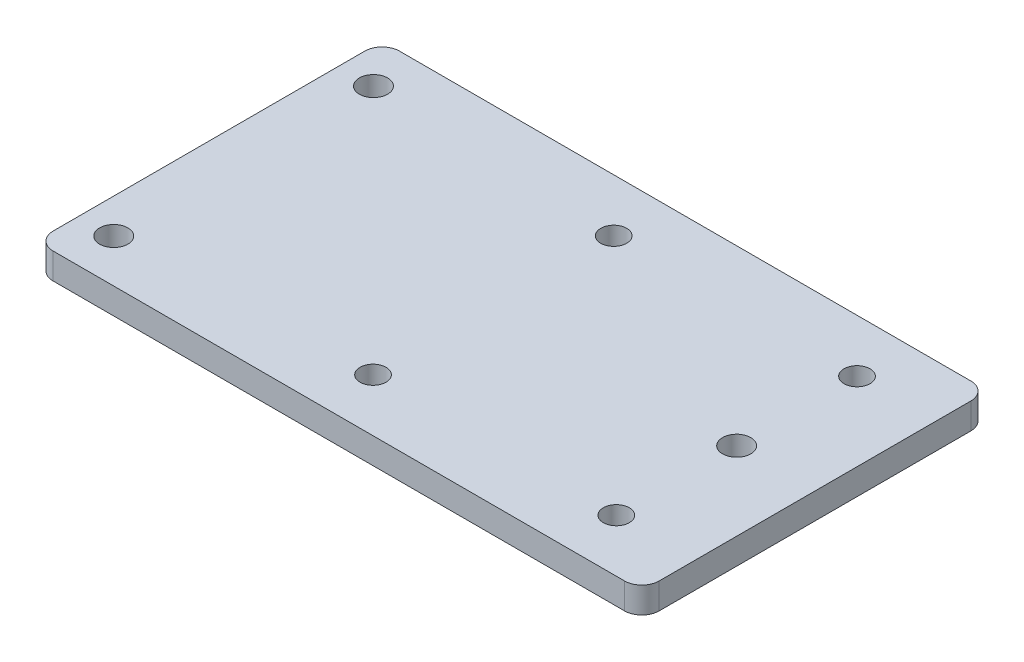
ISO-10303-21;
HEADER;
FILE_DESCRIPTION(('STEP AP214'),'2;1');
FILE_NAME('part.step','',(''),(''),'','','');
FILE_SCHEMA(('AUTOMOTIVE_DESIGN { 1 0 10303 214 1 1 1 1 }'));
ENDSEC;
DATA;
#1=APPLICATION_CONTEXT('core data for automotive mechanical design processes');
#2=APPLICATION_PROTOCOL_DEFINITION('international standard','automotive_design',2000,#1);
#3=PRODUCT_CONTEXT('',#1,'mechanical');
#4=PRODUCT('Part','Part','',(#3));
#5=PRODUCT_RELATED_PRODUCT_CATEGORY('part','',(#4));
#6=PRODUCT_DEFINITION_FORMATION('','',#4);
#7=PRODUCT_DEFINITION_CONTEXT('part definition',#1,'design');
#8=PRODUCT_DEFINITION('design','',#6,#7);
#9=PRODUCT_DEFINITION_SHAPE('','',#8);
#10=(LENGTH_UNIT() NAMED_UNIT(*) SI_UNIT(.MILLI.,.METRE.));
#11=(NAMED_UNIT(*) PLANE_ANGLE_UNIT() SI_UNIT($,.RADIAN.));
#12=(NAMED_UNIT(*) SI_UNIT($,.STERADIAN.) SOLID_ANGLE_UNIT());
#13=UNCERTAINTY_MEASURE_WITH_UNIT(LENGTH_MEASURE(1.E-05),#10,'distance_accuracy_value','');
#14=(GEOMETRIC_REPRESENTATION_CONTEXT(3) GLOBAL_UNCERTAINTY_ASSIGNED_CONTEXT((#13)) GLOBAL_UNIT_ASSIGNED_CONTEXT((#10,
#11,#12)) REPRESENTATION_CONTEXT('',''));
#15=CARTESIAN_POINT('',(0.,0.,0.));
#16=DIRECTION('',(0.,0.,1.));
#17=DIRECTION('',(1.,0.,0.));
#18=AXIS2_PLACEMENT_3D('',#15,#16,#17);
#19=CARTESIAN_POINT('',(35.,3.,-20.));
#20=DIRECTION('',(-1.,0.,0.));
#21=DIRECTION('',(0.,0.,1.));
#22=AXIS2_PLACEMENT_3D('',#19,#20,#21);
#23=PLANE('',#22);
#24=DIRECTION('',(0.,0.,-1.));
#25=VECTOR('',#24,1.);
#26=CARTESIAN_POINT('',(35.,0.,-20.));
#27=LINE('',#26,#25);
#28=CARTESIAN_POINT('',(35.,0.,18.));
#29=VERTEX_POINT('',#28);
#30=CARTESIAN_POINT('',(35.,0.,-18.));
#31=VERTEX_POINT('',#30);
#32=EDGE_CURVE('E128',#29,#31,#27,.T.);
#33=ORIENTED_EDGE('',*,*,#32,.T.);
#34=DIRECTION('',(0.,-1.,0.));
#35=VECTOR('',#34,1.);
#36=CARTESIAN_POINT('',(35.,3.,-18.));
#37=LINE('',#36,#35);
#38=CARTESIAN_POINT('',(35.,3.,-18.));
#39=VERTEX_POINT('',#38);
#40=EDGE_CURVE('E105',#31,#39,#37,.F.);
#41=ORIENTED_EDGE('',*,*,#40,.T.);
#42=DIRECTION('',(0.,0.,-1.));
#43=VECTOR('',#42,1.);
#44=CARTESIAN_POINT('',(35.,3.,-20.));
#45=LINE('',#44,#43);
#46=CARTESIAN_POINT('',(35.,3.,18.));
#47=VERTEX_POINT('',#46);
#48=EDGE_CURVE('E138',#47,#39,#45,.T.);
#49=ORIENTED_EDGE('',*,*,#48,.F.);
#50=DIRECTION('',(0.,-1.,0.));
#51=VECTOR('',#50,1.);
#52=CARTESIAN_POINT('',(35.,3.,18.));
#53=LINE('',#52,#51);
#54=EDGE_CURVE('E110',#47,#29,#53,.T.);
#55=ORIENTED_EDGE('',*,*,#54,.T.);
#56=EDGE_LOOP('',(#33,#41,#49,#55));
#57=FACE_BOUND('',#56,.T.);
#58=ADVANCED_FACE('F33',(#57),#23,.F.);
#59=CARTESIAN_POINT('',(-35.,3.,-20.));
#60=DIRECTION('',(0.,0.,1.));
#61=DIRECTION('',(1.,0.,0.));
#62=AXIS2_PLACEMENT_3D('',#59,#60,#61);
#63=PLANE('',#62);
#64=DIRECTION('',(-1.,0.,0.));
#65=VECTOR('',#64,1.);
#66=CARTESIAN_POINT('',(-35.,3.,-20.));
#67=LINE('',#66,#65);
#68=CARTESIAN_POINT('',(33.,3.,-20.));
#69=VERTEX_POINT('',#68);
#70=CARTESIAN_POINT('',(-33.,3.,-20.));
#71=VERTEX_POINT('',#70);
#72=EDGE_CURVE('E120',#69,#71,#67,.T.);
#73=ORIENTED_EDGE('',*,*,#72,.F.);
#74=DIRECTION('',(0.,-1.,0.));
#75=VECTOR('',#74,1.);
#76=CARTESIAN_POINT('',(33.,3.,-20.));
#77=LINE('',#76,#75);
#78=CARTESIAN_POINT('',(33.,0.,-20.));
#79=VERTEX_POINT('',#78);
#80=EDGE_CURVE('E104',#69,#79,#77,.T.);
#81=ORIENTED_EDGE('',*,*,#80,.T.);
#82=DIRECTION('',(-1.,0.,0.));
#83=VECTOR('',#82,1.);
#84=CARTESIAN_POINT('',(-35.,0.,-20.));
#85=LINE('',#84,#83);
#86=CARTESIAN_POINT('',(-33.,0.,-20.));
#87=VERTEX_POINT('',#86);
#88=EDGE_CURVE('E117',#79,#87,#85,.T.);
#89=ORIENTED_EDGE('',*,*,#88,.T.);
#90=DIRECTION('',(0.,-1.,0.));
#91=VECTOR('',#90,1.);
#92=CARTESIAN_POINT('',(-33.,3.,-20.));
#93=LINE('',#92,#91);
#94=EDGE_CURVE('E122',#87,#71,#93,.F.);
#95=ORIENTED_EDGE('',*,*,#94,.T.);
#96=EDGE_LOOP('',(#73,#81,#89,#95));
#97=FACE_BOUND('',#96,.T.);
#98=ADVANCED_FACE('F116',(#97),#63,.F.);
#99=CARTESIAN_POINT('',(-35.,3.,-20.));
#100=DIRECTION('',(1.,0.,0.));
#101=DIRECTION('',(0.,0.,-1.));
#102=AXIS2_PLACEMENT_3D('',#99,#100,#101);
#103=PLANE('',#102);
#104=DIRECTION('',(0.,0.,1.));
#105=VECTOR('',#104,1.);
#106=CARTESIAN_POINT('',(-35.,3.,-20.));
#107=LINE('',#106,#105);
#108=CARTESIAN_POINT('',(-35.,3.,-18.));
#109=VERTEX_POINT('',#108);
#110=CARTESIAN_POINT('',(-35.,3.,18.));
#111=VERTEX_POINT('',#110);
#112=EDGE_CURVE('E161',#109,#111,#107,.T.);
#113=ORIENTED_EDGE('',*,*,#112,.F.);
#114=DIRECTION('',(0.,-1.,0.));
#115=VECTOR('',#114,1.);
#116=CARTESIAN_POINT('',(-35.,3.,-18.));
#117=LINE('',#116,#115);
#118=CARTESIAN_POINT('',(-35.,0.,-18.));
#119=VERTEX_POINT('',#118);
#120=EDGE_CURVE('E11',#109,#119,#117,.T.);
#121=ORIENTED_EDGE('',*,*,#120,.T.);
#122=DIRECTION('',(0.,0.,1.));
#123=VECTOR('',#122,1.);
#124=CARTESIAN_POINT('',(-35.,0.,-20.));
#125=LINE('',#124,#123);
#126=CARTESIAN_POINT('',(-35.,0.,18.));
#127=VERTEX_POINT('',#126);
#128=EDGE_CURVE('E127',#119,#127,#125,.T.);
#129=ORIENTED_EDGE('',*,*,#128,.T.);
#130=DIRECTION('',(0.,-1.,0.));
#131=VECTOR('',#130,1.);
#132=CARTESIAN_POINT('',(-35.,3.,18.));
#133=LINE('',#132,#131);
#134=EDGE_CURVE('E41',#127,#111,#133,.F.);
#135=ORIENTED_EDGE('',*,*,#134,.T.);
#136=EDGE_LOOP('',(#113,#121,#129,#135));
#137=FACE_BOUND('',#136,.T.);
#138=ADVANCED_FACE('F160',(#137),#103,.F.);
#139=CARTESIAN_POINT('',(-35.,3.,20.));
#140=DIRECTION('',(0.,0.,-1.));
#141=DIRECTION('',(-1.,0.,0.));
#142=AXIS2_PLACEMENT_3D('',#139,#140,#141);
#143=PLANE('',#142);
#144=DIRECTION('',(1.,0.,0.));
#145=VECTOR('',#144,1.);
#146=CARTESIAN_POINT('',(-35.,0.,20.));
#147=LINE('',#146,#145);
#148=CARTESIAN_POINT('',(-33.,0.,20.));
#149=VERTEX_POINT('',#148);
#150=CARTESIAN_POINT('',(33.,0.,20.));
#151=VERTEX_POINT('',#150);
#152=EDGE_CURVE('E131',#149,#151,#147,.T.);
#153=ORIENTED_EDGE('',*,*,#152,.T.);
#154=DIRECTION('',(0.,-1.,0.));
#155=VECTOR('',#154,1.);
#156=CARTESIAN_POINT('',(33.,3.,20.));
#157=LINE('',#156,#155);
#158=CARTESIAN_POINT('',(33.,3.,20.));
#159=VERTEX_POINT('',#158);
#160=EDGE_CURVE('E48',#151,#159,#157,.F.);
#161=ORIENTED_EDGE('',*,*,#160,.T.);
#162=DIRECTION('',(1.,0.,0.));
#163=VECTOR('',#162,1.);
#164=CARTESIAN_POINT('',(-35.,3.,20.));
#165=LINE('',#164,#163);
#166=CARTESIAN_POINT('',(-33.,3.,20.));
#167=VERTEX_POINT('',#166);
#168=EDGE_CURVE('E139',#167,#159,#165,.T.);
#169=ORIENTED_EDGE('',*,*,#168,.F.);
#170=DIRECTION('',(0.,-1.,0.));
#171=VECTOR('',#170,1.);
#172=CARTESIAN_POINT('',(-33.,3.,20.));
#173=LINE('',#172,#171);
#174=EDGE_CURVE('E154',#167,#149,#173,.T.);
#175=ORIENTED_EDGE('',*,*,#174,.T.);
#176=EDGE_LOOP('',(#153,#161,#169,#175));
#177=FACE_BOUND('',#176,.T.);
#178=ADVANCED_FACE('F170',(#177),#143,.F.);
#179=CARTESIAN_POINT('',(0.,3.,0.));
#180=DIRECTION('',(0.,1.,0.));
#181=DIRECTION('',(0.,0.,1.));
#182=AXIS2_PLACEMENT_3D('',#179,#180,#181);
#183=PLANE('',#182);
#184=CARTESIAN_POINT('',(-31.,3.,-15.));
#185=DIRECTION('',(0.,1.,0.));
#186=DIRECTION('',(0.,0.,1.));
#187=AXIS2_PLACEMENT_3D('',#184,#185,#186);
#188=CIRCLE('',#187,1.63195);
#189=CARTESIAN_POINT('',(-31.,3.,-13.36805));
#190=VERTEX_POINT('',#189);
#191=EDGE_CURVE('E218',#190,#190,#188,.T.);
#192=ORIENTED_EDGE('',*,*,#191,.F.);
#193=EDGE_LOOP('',(#192));
#194=FACE_BOUND('',#193,.T.);
#195=CARTESIAN_POINT('',(-31.,3.,15.));
#196=DIRECTION('',(0.,1.,0.));
#197=DIRECTION('',(0.,0.,1.));
#198=AXIS2_PLACEMENT_3D('',#195,#196,#197);
#199=CIRCLE('',#198,1.63195);
#200=CARTESIAN_POINT('',(-31.,3.,16.63195));
#201=VERTEX_POINT('',#200);
#202=EDGE_CURVE('E212',#201,#201,#199,.T.);
#203=ORIENTED_EDGE('',*,*,#202,.F.);
#204=EDGE_LOOP('',(#203));
#205=FACE_BOUND('',#204,.T.);
#206=CARTESIAN_POINT('',(25.95,3.,0.));
#207=DIRECTION('',(0.,1.,0.));
#208=DIRECTION('',(0.,0.,1.));
#209=AXIS2_PLACEMENT_3D('',#206,#207,#208);
#210=CIRCLE('',#209,1.63195);
#211=CARTESIAN_POINT('',(25.95,3.,1.63195));
#212=VERTEX_POINT('',#211);
#213=EDGE_CURVE('E206',#212,#212,#210,.T.);
#214=ORIENTED_EDGE('',*,*,#213,.F.);
#215=EDGE_LOOP('',(#214));
#216=FACE_BOUND('',#215,.T.);
#217=CARTESIAN_POINT('',(-2.14999999999999,3.,-13.9));
#218=DIRECTION('',(0.,1.,0.));
#219=DIRECTION('',(0.,0.,1.));
#220=AXIS2_PLACEMENT_3D('',#217,#218,#219);
#221=CIRCLE('',#220,1.49999999999999);
#222=CARTESIAN_POINT('',(-2.14999999999999,3.,-12.4));
#223=VERTEX_POINT('',#222);
#224=EDGE_CURVE('E200',#223,#223,#221,.T.);
#225=ORIENTED_EDGE('',*,*,#224,.F.);
#226=EDGE_LOOP('',(#225));
#227=FACE_BOUND('',#226,.T.);
#228=CARTESIAN_POINT('',(25.95,3.,-13.9));
#229=DIRECTION('',(0.,1.,0.));
#230=DIRECTION('',(0.,0.,1.));
#231=AXIS2_PLACEMENT_3D('',#228,#229,#230);
#232=CIRCLE('',#231,1.49999999999999);
#233=CARTESIAN_POINT('',(25.95,3.,-12.4));
#234=VERTEX_POINT('',#233);
#235=EDGE_CURVE('E194',#234,#234,#232,.T.);
#236=ORIENTED_EDGE('',*,*,#235,.F.);
#237=EDGE_LOOP('',(#236));
#238=FACE_BOUND('',#237,.T.);
#239=CARTESIAN_POINT('',(-2.14999999999999,3.,13.9));
#240=DIRECTION('',(0.,1.,0.));
#241=DIRECTION('',(0.,0.,1.));
#242=AXIS2_PLACEMENT_3D('',#239,#240,#241);
#243=CIRCLE('',#242,1.49999999999999);
#244=CARTESIAN_POINT('',(-2.14999999999999,3.,15.4));
#245=VERTEX_POINT('',#244);
#246=EDGE_CURVE('E188',#245,#245,#243,.T.);
#247=ORIENTED_EDGE('',*,*,#246,.F.);
#248=EDGE_LOOP('',(#247));
#249=FACE_BOUND('',#248,.T.);
#250=CARTESIAN_POINT('',(25.95,3.,13.9));
#251=DIRECTION('',(0.,1.,0.));
#252=DIRECTION('',(0.,0.,1.));
#253=AXIS2_PLACEMENT_3D('',#250,#251,#252);
#254=CIRCLE('',#253,1.49999999999999);
#255=CARTESIAN_POINT('',(25.95,3.,15.4));
#256=VERTEX_POINT('',#255);
#257=EDGE_CURVE('E182',#256,#256,#254,.T.);
#258=ORIENTED_EDGE('',*,*,#257,.F.);
#259=EDGE_LOOP('',(#258));
#260=FACE_BOUND('',#259,.T.);
#261=ORIENTED_EDGE('',*,*,#48,.T.);
#262=CARTESIAN_POINT('',(33.,3.,-18.));
#263=DIRECTION('',(0.,1.,0.));
#264=DIRECTION('',(0.,0.,1.));
#265=AXIS2_PLACEMENT_3D('',#262,#263,#264);
#266=CIRCLE('',#265,2.);
#267=EDGE_CURVE('E152',#39,#69,#266,.T.);
#268=ORIENTED_EDGE('',*,*,#267,.T.);
#269=ORIENTED_EDGE('',*,*,#72,.T.);
#270=CARTESIAN_POINT('',(-33.,3.,-18.));
#271=DIRECTION('',(0.,1.,0.));
#272=DIRECTION('',(0.,0.,1.));
#273=AXIS2_PLACEMENT_3D('',#270,#271,#272);
#274=CIRCLE('',#273,2.);
#275=EDGE_CURVE('E148',#71,#109,#274,.T.);
#276=ORIENTED_EDGE('',*,*,#275,.T.);
#277=ORIENTED_EDGE('',*,*,#112,.T.);
#278=CARTESIAN_POINT('',(-33.,3.,18.));
#279=DIRECTION('',(0.,1.,0.));
#280=DIRECTION('',(0.,0.,1.));
#281=AXIS2_PLACEMENT_3D('',#278,#279,#280);
#282=CIRCLE('',#281,2.);
#283=EDGE_CURVE('E55',#111,#167,#282,.T.);
#284=ORIENTED_EDGE('',*,*,#283,.T.);
#285=ORIENTED_EDGE('',*,*,#168,.T.);
#286=CARTESIAN_POINT('',(33.,3.,18.));
#287=DIRECTION('',(0.,1.,0.));
#288=DIRECTION('',(0.,0.,1.));
#289=AXIS2_PLACEMENT_3D('',#286,#287,#288);
#290=CIRCLE('',#289,2.);
#291=EDGE_CURVE('E150',#159,#47,#290,.T.);
#292=ORIENTED_EDGE('',*,*,#291,.T.);
#293=EDGE_LOOP('',(#261,#268,#269,#276,#277,#284,#285,#292));
#294=FACE_BOUND('',#293,.T.);
#295=ADVANCED_FACE('F165',(#194,#205,#216,#227,#238,#249,#260,#294),#183,.T.);
#296=CARTESIAN_POINT('',(0.,0.,0.));
#297=DIRECTION('',(0.,1.,0.));
#298=DIRECTION('',(0.,0.,1.));
#299=AXIS2_PLACEMENT_3D('',#296,#297,#298);
#300=PLANE('',#299);
#301=CARTESIAN_POINT('',(-31.,0.,-15.));
#302=DIRECTION('',(0.,1.,0.));
#303=DIRECTION('',(0.,0.,1.));
#304=AXIS2_PLACEMENT_3D('',#301,#302,#303);
#305=CIRCLE('',#304,1.63195);
#306=CARTESIAN_POINT('',(-31.,0.,-13.36805));
#307=VERTEX_POINT('',#306);
#308=EDGE_CURVE('E215',#307,#307,#305,.T.);
#309=ORIENTED_EDGE('',*,*,#308,.T.);
#310=EDGE_LOOP('',(#309));
#311=FACE_BOUND('',#310,.T.);
#312=CARTESIAN_POINT('',(-31.,0.,15.));
#313=DIRECTION('',(0.,1.,0.));
#314=DIRECTION('',(0.,0.,1.));
#315=AXIS2_PLACEMENT_3D('',#312,#313,#314);
#316=CIRCLE('',#315,1.63195);
#317=CARTESIAN_POINT('',(-31.,0.,16.63195));
#318=VERTEX_POINT('',#317);
#319=EDGE_CURVE('E209',#318,#318,#316,.T.);
#320=ORIENTED_EDGE('',*,*,#319,.T.);
#321=EDGE_LOOP('',(#320));
#322=FACE_BOUND('',#321,.T.);
#323=CARTESIAN_POINT('',(25.95,0.,0.));
#324=DIRECTION('',(0.,1.,0.));
#325=DIRECTION('',(0.,0.,1.));
#326=AXIS2_PLACEMENT_3D('',#323,#324,#325);
#327=CIRCLE('',#326,1.63195);
#328=CARTESIAN_POINT('',(25.95,0.,1.63195));
#329=VERTEX_POINT('',#328);
#330=EDGE_CURVE('E203',#329,#329,#327,.T.);
#331=ORIENTED_EDGE('',*,*,#330,.T.);
#332=EDGE_LOOP('',(#331));
#333=FACE_BOUND('',#332,.T.);
#334=CARTESIAN_POINT('',(-2.14999999999999,0.,-13.9));
#335=DIRECTION('',(0.,1.,0.));
#336=DIRECTION('',(0.,0.,1.));
#337=AXIS2_PLACEMENT_3D('',#334,#335,#336);
#338=CIRCLE('',#337,1.5);
#339=CARTESIAN_POINT('',(-2.14999999999999,0.,-12.4));
#340=VERTEX_POINT('',#339);
#341=EDGE_CURVE('E197',#340,#340,#338,.T.);
#342=ORIENTED_EDGE('',*,*,#341,.T.);
#343=EDGE_LOOP('',(#342));
#344=FACE_BOUND('',#343,.T.);
#345=CARTESIAN_POINT('',(25.95,0.,-13.9));
#346=DIRECTION('',(0.,1.,0.));
#347=DIRECTION('',(0.,0.,1.));
#348=AXIS2_PLACEMENT_3D('',#345,#346,#347);
#349=CIRCLE('',#348,1.5);
#350=CARTESIAN_POINT('',(25.95,0.,-12.4));
#351=VERTEX_POINT('',#350);
#352=EDGE_CURVE('E191',#351,#351,#349,.T.);
#353=ORIENTED_EDGE('',*,*,#352,.T.);
#354=EDGE_LOOP('',(#353));
#355=FACE_BOUND('',#354,.T.);
#356=CARTESIAN_POINT('',(-2.14999999999999,0.,13.9));
#357=DIRECTION('',(0.,1.,0.));
#358=DIRECTION('',(0.,0.,1.));
#359=AXIS2_PLACEMENT_3D('',#356,#357,#358);
#360=CIRCLE('',#359,1.5);
#361=CARTESIAN_POINT('',(-2.14999999999999,0.,15.4));
#362=VERTEX_POINT('',#361);
#363=EDGE_CURVE('E185',#362,#362,#360,.T.);
#364=ORIENTED_EDGE('',*,*,#363,.T.);
#365=EDGE_LOOP('',(#364));
#366=FACE_BOUND('',#365,.T.);
#367=CARTESIAN_POINT('',(25.95,0.,13.9));
#368=DIRECTION('',(0.,1.,0.));
#369=DIRECTION('',(0.,0.,1.));
#370=AXIS2_PLACEMENT_3D('',#367,#368,#369);
#371=CIRCLE('',#370,1.5);
#372=CARTESIAN_POINT('',(25.95,0.,15.4));
#373=VERTEX_POINT('',#372);
#374=EDGE_CURVE('E133',#373,#373,#371,.T.);
#375=ORIENTED_EDGE('',*,*,#374,.T.);
#376=EDGE_LOOP('',(#375));
#377=FACE_BOUND('',#376,.T.);
#378=ORIENTED_EDGE('',*,*,#88,.F.);
#379=CARTESIAN_POINT('',(33.,0.,-18.));
#380=DIRECTION('',(0.,1.,0.));
#381=DIRECTION('',(0.,0.,1.));
#382=AXIS2_PLACEMENT_3D('',#379,#380,#381);
#383=CIRCLE('',#382,2.);
#384=EDGE_CURVE('E100',#79,#31,#383,.F.);
#385=ORIENTED_EDGE('',*,*,#384,.T.);
#386=ORIENTED_EDGE('',*,*,#32,.F.);
#387=CARTESIAN_POINT('',(33.,0.,18.));
#388=DIRECTION('',(0.,1.,0.));
#389=DIRECTION('',(0.,0.,1.));
#390=AXIS2_PLACEMENT_3D('',#387,#388,#389);
#391=CIRCLE('',#390,2.);
#392=EDGE_CURVE('E111',#29,#151,#391,.F.);
#393=ORIENTED_EDGE('',*,*,#392,.T.);
#394=ORIENTED_EDGE('',*,*,#152,.F.);
#395=CARTESIAN_POINT('',(-33.,0.,18.));
#396=DIRECTION('',(0.,1.,0.));
#397=DIRECTION('',(0.,0.,1.));
#398=AXIS2_PLACEMENT_3D('',#395,#396,#397);
#399=CIRCLE('',#398,2.);
#400=EDGE_CURVE('E121',#149,#127,#399,.F.);
#401=ORIENTED_EDGE('',*,*,#400,.T.);
#402=ORIENTED_EDGE('',*,*,#128,.F.);
#403=CARTESIAN_POINT('',(-33.,0.,-18.));
#404=DIRECTION('',(0.,1.,0.));
#405=DIRECTION('',(0.,0.,1.));
#406=AXIS2_PLACEMENT_3D('',#403,#404,#405);
#407=CIRCLE('',#406,2.);
#408=EDGE_CURVE('E126',#119,#87,#407,.F.);
#409=ORIENTED_EDGE('',*,*,#408,.T.);
#410=EDGE_LOOP('',(#378,#385,#386,#393,#394,#401,#402,#409));
#411=FACE_BOUND('',#410,.T.);
#412=ADVANCED_FACE('F124',(#311,#322,#333,#344,#355,#366,#377,#411),#300,.F.);
#413=CARTESIAN_POINT('',(25.95,3.,13.9));
#414=DIRECTION('',(0.,1.,0.));
#415=DIRECTION('',(0.,0.,1.));
#416=AXIS2_PLACEMENT_3D('',#413,#414,#415);
#417=CYLINDRICAL_SURFACE('',#416,1.49999999999999);
#418=ORIENTED_EDGE('',*,*,#374,.F.);
#419=EDGE_LOOP('',(#418));
#420=FACE_BOUND('',#419,.T.);
#421=ORIENTED_EDGE('',*,*,#257,.T.);
#422=EDGE_LOOP('',(#421));
#423=FACE_BOUND('',#422,.T.);
#424=ADVANCED_FACE('F239',(#420,#423),#417,.F.);
#425=CARTESIAN_POINT('',(-2.14999999999999,3.,13.9));
#426=DIRECTION('',(0.,1.,0.));
#427=DIRECTION('',(0.,0.,1.));
#428=AXIS2_PLACEMENT_3D('',#425,#426,#427);
#429=CYLINDRICAL_SURFACE('',#428,1.49999999999999);
#430=ORIENTED_EDGE('',*,*,#363,.F.);
#431=EDGE_LOOP('',(#430));
#432=FACE_BOUND('',#431,.T.);
#433=ORIENTED_EDGE('',*,*,#246,.T.);
#434=EDGE_LOOP('',(#433));
#435=FACE_BOUND('',#434,.T.);
#436=ADVANCED_FACE('F241',(#432,#435),#429,.F.);
#437=CARTESIAN_POINT('',(25.95,3.,-13.9));
#438=DIRECTION('',(0.,1.,0.));
#439=DIRECTION('',(0.,0.,1.));
#440=AXIS2_PLACEMENT_3D('',#437,#438,#439);
#441=CYLINDRICAL_SURFACE('',#440,1.49999999999999);
#442=ORIENTED_EDGE('',*,*,#352,.F.);
#443=EDGE_LOOP('',(#442));
#444=FACE_BOUND('',#443,.T.);
#445=ORIENTED_EDGE('',*,*,#235,.T.);
#446=EDGE_LOOP('',(#445));
#447=FACE_BOUND('',#446,.T.);
#448=ADVANCED_FACE('F248',(#444,#447),#441,.F.);
#449=CARTESIAN_POINT('',(-2.14999999999999,3.,-13.9));
#450=DIRECTION('',(0.,1.,0.));
#451=DIRECTION('',(0.,0.,1.));
#452=AXIS2_PLACEMENT_3D('',#449,#450,#451);
#453=CYLINDRICAL_SURFACE('',#452,1.49999999999999);
#454=ORIENTED_EDGE('',*,*,#341,.F.);
#455=EDGE_LOOP('',(#454));
#456=FACE_BOUND('',#455,.T.);
#457=ORIENTED_EDGE('',*,*,#224,.T.);
#458=EDGE_LOOP('',(#457));
#459=FACE_BOUND('',#458,.T.);
#460=ADVANCED_FACE('F356',(#456,#459),#453,.F.);
#461=CARTESIAN_POINT('',(25.95,3.,0.));
#462=DIRECTION('',(0.,1.,0.));
#463=DIRECTION('',(0.,0.,1.));
#464=AXIS2_PLACEMENT_3D('',#461,#462,#463);
#465=CYLINDRICAL_SURFACE('',#464,1.63195);
#466=ORIENTED_EDGE('',*,*,#330,.F.);
#467=EDGE_LOOP('',(#466));
#468=FACE_BOUND('',#467,.T.);
#469=ORIENTED_EDGE('',*,*,#213,.T.);
#470=EDGE_LOOP('',(#469));
#471=FACE_BOUND('',#470,.T.);
#472=ADVANCED_FACE('F346',(#468,#471),#465,.F.);
#473=CARTESIAN_POINT('',(-31.,3.,15.));
#474=DIRECTION('',(0.,1.,0.));
#475=DIRECTION('',(0.,0.,1.));
#476=AXIS2_PLACEMENT_3D('',#473,#474,#475);
#477=CYLINDRICAL_SURFACE('',#476,1.63195);
#478=ORIENTED_EDGE('',*,*,#319,.F.);
#479=EDGE_LOOP('',(#478));
#480=FACE_BOUND('',#479,.T.);
#481=ORIENTED_EDGE('',*,*,#202,.T.);
#482=EDGE_LOOP('',(#481));
#483=FACE_BOUND('',#482,.T.);
#484=ADVANCED_FACE('F336',(#480,#483),#477,.F.);
#485=CARTESIAN_POINT('',(-31.,3.,-15.));
#486=DIRECTION('',(0.,1.,0.));
#487=DIRECTION('',(0.,0.,1.));
#488=AXIS2_PLACEMENT_3D('',#485,#486,#487);
#489=CYLINDRICAL_SURFACE('',#488,1.63195);
#490=ORIENTED_EDGE('',*,*,#308,.F.);
#491=EDGE_LOOP('',(#490));
#492=FACE_BOUND('',#491,.T.);
#493=ORIENTED_EDGE('',*,*,#191,.T.);
#494=EDGE_LOOP('',(#493));
#495=FACE_BOUND('',#494,.T.);
#496=ADVANCED_FACE('F222',(#492,#495),#489,.F.);
#497=CARTESIAN_POINT('',(33.,3.,-18.));
#498=DIRECTION('',(0.,-1.,0.));
#499=DIRECTION('',(0.,0.,-1.));
#500=AXIS2_PLACEMENT_3D('',#497,#498,#499);
#501=CYLINDRICAL_SURFACE('',#500,2.);
#502=ORIENTED_EDGE('',*,*,#267,.F.);
#503=ORIENTED_EDGE('',*,*,#40,.F.);
#504=ORIENTED_EDGE('',*,*,#384,.F.);
#505=ORIENTED_EDGE('',*,*,#80,.F.);
#506=EDGE_LOOP('',(#502,#503,#504,#505));
#507=FACE_BOUND('',#506,.T.);
#508=ADVANCED_FACE('F103',(#507),#501,.T.);
#509=CARTESIAN_POINT('',(33.,3.,18.));
#510=DIRECTION('',(0.,-1.,0.));
#511=DIRECTION('',(0.,0.,-1.));
#512=AXIS2_PLACEMENT_3D('',#509,#510,#511);
#513=CYLINDRICAL_SURFACE('',#512,2.);
#514=ORIENTED_EDGE('',*,*,#291,.F.);
#515=ORIENTED_EDGE('',*,*,#160,.F.);
#516=ORIENTED_EDGE('',*,*,#392,.F.);
#517=ORIENTED_EDGE('',*,*,#54,.F.);
#518=EDGE_LOOP('',(#514,#515,#516,#517));
#519=FACE_BOUND('',#518,.T.);
#520=ADVANCED_FACE('F174',(#519),#513,.T.);
#521=CARTESIAN_POINT('',(-33.,3.,-18.));
#522=DIRECTION('',(0.,-1.,0.));
#523=DIRECTION('',(0.,0.,-1.));
#524=AXIS2_PLACEMENT_3D('',#521,#522,#523);
#525=CYLINDRICAL_SURFACE('',#524,2.);
#526=ORIENTED_EDGE('',*,*,#275,.F.);
#527=ORIENTED_EDGE('',*,*,#94,.F.);
#528=ORIENTED_EDGE('',*,*,#408,.F.);
#529=ORIENTED_EDGE('',*,*,#120,.F.);
#530=EDGE_LOOP('',(#526,#527,#528,#529));
#531=FACE_BOUND('',#530,.T.);
#532=ADVANCED_FACE('F265',(#531),#525,.T.);
#533=CARTESIAN_POINT('',(-33.,3.,18.));
#534=DIRECTION('',(0.,-1.,0.));
#535=DIRECTION('',(0.,0.,-1.));
#536=AXIS2_PLACEMENT_3D('',#533,#534,#535);
#537=CYLINDRICAL_SURFACE('',#536,2.);
#538=ORIENTED_EDGE('',*,*,#283,.F.);
#539=ORIENTED_EDGE('',*,*,#134,.F.);
#540=ORIENTED_EDGE('',*,*,#400,.F.);
#541=ORIENTED_EDGE('',*,*,#174,.F.);
#542=EDGE_LOOP('',(#538,#539,#540,#541));
#543=FACE_BOUND('',#542,.T.);
#544=ADVANCED_FACE('F35',(#543),#537,.T.);
#545=CLOSED_SHELL('',(#58,#98,#138,#178,#295,#412,#424,#436,#448,#460,#472,#484,#496,#508,#520,
#532,#544));
#546=MANIFOLD_SOLID_BREP('B2',#545);
#547=ADVANCED_BREP_SHAPE_REPRESENTATION('',(#18,#546),#14);
#548=SHAPE_DEFINITION_REPRESENTATION(#9,#547);
ENDSEC;
END-ISO-10303-21;
